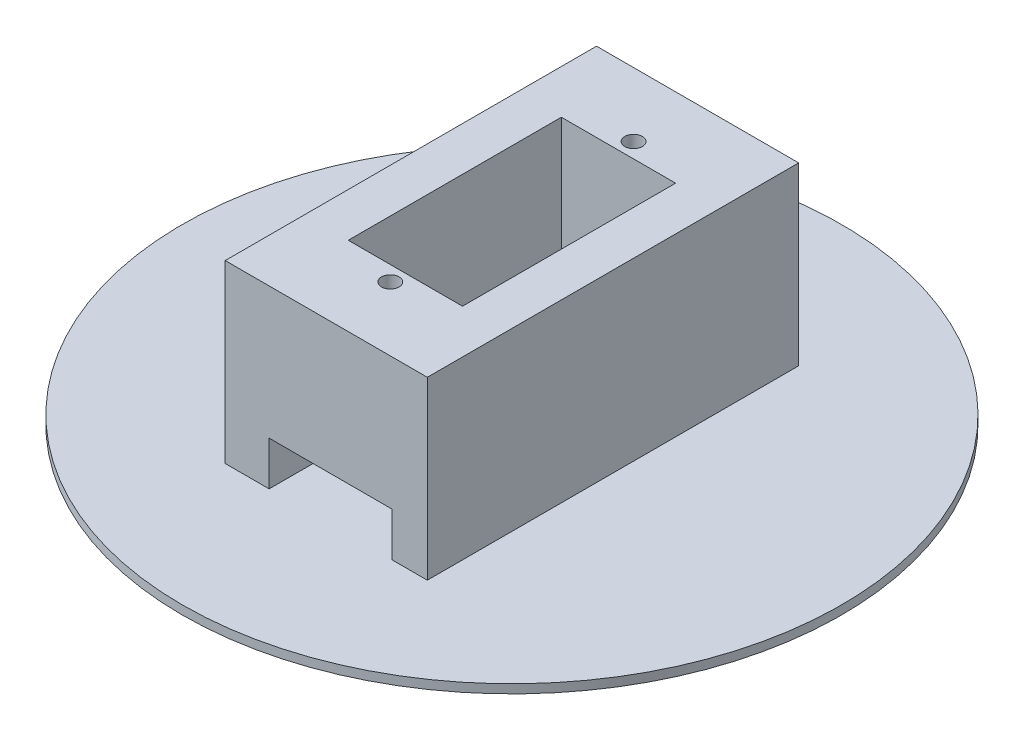
ISO-10303-21;
HEADER;
FILE_DESCRIPTION(('STEP AP214'),'2;1');
FILE_NAME('part.step','',(''),(''),'','','');
FILE_SCHEMA(('AUTOMOTIVE_DESIGN { 1 0 10303 214 1 1 1 1 }'));
ENDSEC;
DATA;
#1=APPLICATION_CONTEXT('core data for automotive mechanical design processes');
#2=APPLICATION_PROTOCOL_DEFINITION('international standard','automotive_design',2000,#1);
#3=PRODUCT_CONTEXT('',#1,'mechanical');
#4=PRODUCT('Part','Part','',(#3));
#5=PRODUCT_RELATED_PRODUCT_CATEGORY('part','',(#4));
#6=PRODUCT_DEFINITION_FORMATION('','',#4);
#7=PRODUCT_DEFINITION_CONTEXT('part definition',#1,'design');
#8=PRODUCT_DEFINITION('design','',#6,#7);
#9=PRODUCT_DEFINITION_SHAPE('','',#8);
#10=(LENGTH_UNIT() NAMED_UNIT(*) SI_UNIT(.MILLI.,.METRE.));
#11=(NAMED_UNIT(*) PLANE_ANGLE_UNIT() SI_UNIT($,.RADIAN.));
#12=(NAMED_UNIT(*) SI_UNIT($,.STERADIAN.) SOLID_ANGLE_UNIT());
#13=UNCERTAINTY_MEASURE_WITH_UNIT(LENGTH_MEASURE(1.E-05),#10,'distance_accuracy_value','');
#14=(GEOMETRIC_REPRESENTATION_CONTEXT(3) GLOBAL_UNCERTAINTY_ASSIGNED_CONTEXT((#13)) GLOBAL_UNIT_ASSIGNED_CONTEXT((#10,
#11,#12)) REPRESENTATION_CONTEXT('',''));
#15=CARTESIAN_POINT('',(0.,0.,0.));
#16=DIRECTION('',(0.,0.,1.));
#17=DIRECTION('',(1.,0.,0.));
#18=AXIS2_PLACEMENT_3D('',#15,#16,#17);
#19=CARTESIAN_POINT('',(-5.,20.,0.));
#20=DIRECTION('',(-1.,0.,0.));
#21=DIRECTION('',(0.,0.,1.));
#22=AXIS2_PLACEMENT_3D('',#19,#20,#21);
#23=PLANE('',#22);
#24=DIRECTION('',(0.,0.,-1.));
#25=VECTOR('',#24,1.);
#26=CARTESIAN_POINT('',(-5.,0.,0.));
#27=LINE('',#26,#25);
#28=CARTESIAN_POINT('',(-5.,0.,5.));
#29=VERTEX_POINT('',#28);
#30=CARTESIAN_POINT('',(-5.,0.,-37.25));
#31=VERTEX_POINT('',#30);
#32=EDGE_CURVE('E228',#29,#31,#27,.T.);
#33=ORIENTED_EDGE('',*,*,#32,.F.);
#34=DIRECTION('',(0.,-1.,0.));
#35=VECTOR('',#34,1.);
#36=CARTESIAN_POINT('',(-5.,20.,5.));
#37=LINE('',#36,#35);
#38=CARTESIAN_POINT('',(-5.,20.,5.));
#39=VERTEX_POINT('',#38);
#40=EDGE_CURVE('E12',#39,#29,#37,.T.);
#41=ORIENTED_EDGE('',*,*,#40,.F.);
#42=DIRECTION('',(0.,0.,-1.));
#43=VECTOR('',#42,1.);
#44=CARTESIAN_POINT('',(-5.,20.,0.));
#45=LINE('',#44,#43);
#46=CARTESIAN_POINT('',(-5.,20.,-37.25));
#47=VERTEX_POINT('',#46);
#48=EDGE_CURVE('E215',#39,#47,#45,.T.);
#49=ORIENTED_EDGE('',*,*,#48,.T.);
#50=DIRECTION('',(0.,-1.,0.));
#51=VECTOR('',#50,1.);
#52=CARTESIAN_POINT('',(-5.,20.,-37.25));
#53=LINE('',#52,#51);
#54=EDGE_CURVE('E239',#47,#31,#53,.T.);
#55=ORIENTED_EDGE('',*,*,#54,.T.);
#56=EDGE_LOOP('',(#33,#41,#49,#55));
#57=FACE_BOUND('',#56,.T.);
#58=ADVANCED_FACE('F51',(#57),#23,.T.);
#59=CARTESIAN_POINT('',(0.,20.,5.));
#60=DIRECTION('',(0.,0.,-1.));
#61=DIRECTION('',(-1.,0.,0.));
#62=AXIS2_PLACEMENT_3D('',#59,#60,#61);
#63=PLANE('',#62);
#64=DIRECTION('',(1.,0.,0.));
#65=VECTOR('',#64,1.);
#66=CARTESIAN_POINT('',(0.,0.,5.));
#67=LINE('',#66,#65);
#68=CARTESIAN_POINT('',(0.,0.,5.));
#69=VERTEX_POINT('',#68);
#70=EDGE_CURVE('E231',#29,#69,#67,.T.);
#71=ORIENTED_EDGE('',*,*,#70,.T.);
#72=DIRECTION('',(0.,1.,0.));
#73=VECTOR('',#72,1.);
#74=CARTESIAN_POINT('',(0.,20.,5.));
#75=LINE('',#74,#73);
#76=CARTESIAN_POINT('',(0.,5.,5.));
#77=VERTEX_POINT('',#76);
#78=EDGE_CURVE('E170',#69,#77,#75,.T.);
#79=ORIENTED_EDGE('',*,*,#78,.T.);
#80=DIRECTION('',(1.,0.,0.));
#81=VECTOR('',#80,1.);
#82=CARTESIAN_POINT('',(0.,5.,5.));
#83=LINE('',#82,#81);
#84=CARTESIAN_POINT('',(14.,5.,5.));
#85=VERTEX_POINT('',#84);
#86=EDGE_CURVE('E188',#77,#85,#83,.T.);
#87=ORIENTED_EDGE('',*,*,#86,.T.);
#88=DIRECTION('',(0.,-1.,0.));
#89=VECTOR('',#88,1.);
#90=CARTESIAN_POINT('',(14.,20.,5.));
#91=LINE('',#90,#89);
#92=CARTESIAN_POINT('',(14.,0.,5.));
#93=VERTEX_POINT('',#92);
#94=EDGE_CURVE('E174',#85,#93,#91,.T.);
#95=ORIENTED_EDGE('',*,*,#94,.T.);
#96=CARTESIAN_POINT('',(18.,0.,5.));
#97=VERTEX_POINT('',#96);
#98=EDGE_CURVE('E230',#93,#97,#67,.T.);
#99=ORIENTED_EDGE('',*,*,#98,.T.);
#100=DIRECTION('',(0.,-1.,0.));
#101=VECTOR('',#100,1.);
#102=CARTESIAN_POINT('',(18.,20.,5.));
#103=LINE('',#102,#101);
#104=CARTESIAN_POINT('',(18.,20.,5.));
#105=VERTEX_POINT('',#104);
#106=EDGE_CURVE('E60',#105,#97,#103,.T.);
#107=ORIENTED_EDGE('',*,*,#106,.F.);
#108=DIRECTION('',(1.,0.,0.));
#109=VECTOR('',#108,1.);
#110=CARTESIAN_POINT('',(0.,20.,5.));
#111=LINE('',#110,#109);
#112=EDGE_CURVE('E218',#39,#105,#111,.T.);
#113=ORIENTED_EDGE('',*,*,#112,.F.);
#114=ORIENTED_EDGE('',*,*,#40,.T.);
#115=EDGE_LOOP('',(#71,#79,#87,#95,#99,#107,#113,#114));
#116=FACE_BOUND('',#115,.T.);
#117=ADVANCED_FACE('F278',(#116),#63,.F.);
#118=CARTESIAN_POINT('',(18.,20.,0.));
#119=DIRECTION('',(-1.,0.,0.));
#120=DIRECTION('',(0.,0.,1.));
#121=AXIS2_PLACEMENT_3D('',#118,#119,#120);
#122=PLANE('',#121);
#123=DIRECTION('',(0.,0.,-1.));
#124=VECTOR('',#123,1.);
#125=CARTESIAN_POINT('',(18.,0.,0.));
#126=LINE('',#125,#124);
#127=CARTESIAN_POINT('',(18.,0.,-37.25));
#128=VERTEX_POINT('',#127);
#129=EDGE_CURVE('E234',#97,#128,#126,.T.);
#130=ORIENTED_EDGE('',*,*,#129,.T.);
#131=DIRECTION('',(0.,-1.,0.));
#132=VECTOR('',#131,1.);
#133=CARTESIAN_POINT('',(18.,20.,-37.25));
#134=LINE('',#133,#132);
#135=CARTESIAN_POINT('',(18.,20.,-37.25));
#136=VERTEX_POINT('',#135);
#137=EDGE_CURVE('E242',#136,#128,#134,.T.);
#138=ORIENTED_EDGE('',*,*,#137,.F.);
#139=DIRECTION('',(0.,0.,-1.));
#140=VECTOR('',#139,1.);
#141=CARTESIAN_POINT('',(18.,20.,0.));
#142=LINE('',#141,#140);
#143=EDGE_CURVE('E221',#105,#136,#142,.T.);
#144=ORIENTED_EDGE('',*,*,#143,.F.);
#145=ORIENTED_EDGE('',*,*,#106,.T.);
#146=EDGE_LOOP('',(#130,#138,#144,#145));
#147=FACE_BOUND('',#146,.T.);
#148=ADVANCED_FACE('F284',(#147),#122,.F.);
#149=CARTESIAN_POINT('',(0.,20.,-28.25));
#150=DIRECTION('',(0.,0.,1.));
#151=DIRECTION('',(1.,0.,0.));
#152=AXIS2_PLACEMENT_3D('',#149,#150,#151);
#153=PLANE('',#152);
#154=DIRECTION('',(-1.,0.,0.));
#155=VECTOR('',#154,1.);
#156=CARTESIAN_POINT('',(0.,5.,-28.25));
#157=LINE('',#156,#155);
#158=CARTESIAN_POINT('',(13.,5.,-28.25));
#159=VERTEX_POINT('',#158);
#160=CARTESIAN_POINT('',(0.,5.,-28.25));
#161=VERTEX_POINT('',#160);
#162=EDGE_CURVE('E146',#159,#161,#157,.T.);
#163=ORIENTED_EDGE('',*,*,#162,.F.);
#164=DIRECTION('',(0.,-1.,0.));
#165=VECTOR('',#164,1.);
#166=CARTESIAN_POINT('',(13.,20.,-28.25));
#167=LINE('',#166,#165);
#168=CARTESIAN_POINT('',(13.,20.,-28.25));
#169=VERTEX_POINT('',#168);
#170=EDGE_CURVE('E55',#169,#159,#167,.T.);
#171=ORIENTED_EDGE('',*,*,#170,.F.);
#172=DIRECTION('',(-1.,0.,0.));
#173=VECTOR('',#172,1.);
#174=CARTESIAN_POINT('',(0.,20.,-28.25));
#175=LINE('',#174,#173);
#176=CARTESIAN_POINT('',(0.,20.,-28.25));
#177=VERTEX_POINT('',#176);
#178=EDGE_CURVE('E200',#169,#177,#175,.T.);
#179=ORIENTED_EDGE('',*,*,#178,.T.);
#180=DIRECTION('',(0.,-1.,0.));
#181=VECTOR('',#180,1.);
#182=CARTESIAN_POINT('',(0.,20.,-28.25));
#183=LINE('',#182,#181);
#184=EDGE_CURVE('E226',#177,#161,#183,.T.);
#185=ORIENTED_EDGE('',*,*,#184,.T.);
#186=EDGE_LOOP('',(#163,#171,#179,#185));
#187=FACE_BOUND('',#186,.T.);
#188=ADVANCED_FACE('F260',(#187),#153,.T.);
#189=CARTESIAN_POINT('',(13.,20.,0.));
#190=DIRECTION('',(-1.,0.,0.));
#191=DIRECTION('',(0.,0.,1.));
#192=AXIS2_PLACEMENT_3D('',#189,#190,#191);
#193=PLANE('',#192);
#194=DIRECTION('',(0.,0.,-1.));
#195=VECTOR('',#194,1.);
#196=CARTESIAN_POINT('',(13.,5.,0.));
#197=LINE('',#196,#195);
#198=CARTESIAN_POINT('',(13.,5.,-4.));
#199=VERTEX_POINT('',#198);
#200=EDGE_CURVE('E185',#199,#159,#197,.T.);
#201=ORIENTED_EDGE('',*,*,#200,.F.);
#202=DIRECTION('',(0.,-1.,0.));
#203=VECTOR('',#202,1.);
#204=CARTESIAN_POINT('',(13.,20.,-4.));
#205=LINE('',#204,#203);
#206=CARTESIAN_POINT('',(13.,20.,-4.));
#207=VERTEX_POINT('',#206);
#208=EDGE_CURVE('E249',#207,#199,#205,.T.);
#209=ORIENTED_EDGE('',*,*,#208,.F.);
#210=DIRECTION('',(0.,0.,-1.));
#211=VECTOR('',#210,1.);
#212=CARTESIAN_POINT('',(13.,20.,0.));
#213=LINE('',#212,#211);
#214=EDGE_CURVE('E204',#207,#169,#213,.T.);
#215=ORIENTED_EDGE('',*,*,#214,.T.);
#216=ORIENTED_EDGE('',*,*,#170,.T.);
#217=EDGE_LOOP('',(#201,#209,#215,#216));
#218=FACE_BOUND('',#217,.T.);
#219=ADVANCED_FACE('F256',(#218),#193,.T.);
#220=CARTESIAN_POINT('',(0.,20.,-4.));
#221=DIRECTION('',(0.,0.,1.));
#222=DIRECTION('',(1.,0.,0.));
#223=AXIS2_PLACEMENT_3D('',#220,#221,#222);
#224=PLANE('',#223);
#225=ORIENTED_EDGE('',*,*,#208,.T.);
#226=DIRECTION('',(-1.,0.,0.));
#227=VECTOR('',#226,1.);
#228=CARTESIAN_POINT('',(0.,5.,-4.));
#229=LINE('',#228,#227);
#230=CARTESIAN_POINT('',(0.,5.,-4.));
#231=VERTEX_POINT('',#230);
#232=EDGE_CURVE('E183',#199,#231,#229,.T.);
#233=ORIENTED_EDGE('',*,*,#232,.T.);
#234=DIRECTION('',(0.,-1.,0.));
#235=VECTOR('',#234,1.);
#236=CARTESIAN_POINT('',(0.,20.,-4.));
#237=LINE('',#236,#235);
#238=CARTESIAN_POINT('',(0.,20.,-4.));
#239=VERTEX_POINT('',#238);
#240=EDGE_CURVE('E248',#239,#231,#237,.T.);
#241=ORIENTED_EDGE('',*,*,#240,.F.);
#242=DIRECTION('',(-1.,0.,0.));
#243=VECTOR('',#242,1.);
#244=CARTESIAN_POINT('',(0.,20.,-4.));
#245=LINE('',#244,#243);
#246=EDGE_CURVE('E207',#207,#239,#245,.T.);
#247=ORIENTED_EDGE('',*,*,#246,.F.);
#248=EDGE_LOOP('',(#225,#233,#241,#247));
#249=FACE_BOUND('',#248,.T.);
#250=ADVANCED_FACE('F265',(#249),#224,.F.);
#251=CARTESIAN_POINT('',(6.5,20.,-2.286));
#252=DIRECTION('',(0.,-1.,0.));
#253=DIRECTION('',(0.,0.,-1.));
#254=AXIS2_PLACEMENT_3D('',#251,#252,#253);
#255=CYLINDRICAL_SURFACE('',#254,1.);
#256=CARTESIAN_POINT('',(6.5,5.,-2.286));
#257=DIRECTION('',(0.,1.,0.));
#258=DIRECTION('',(-1.,0.,0.));
#259=AXIS2_PLACEMENT_3D('',#256,#257,#258);
#260=CIRCLE('',#259,1.);
#261=CARTESIAN_POINT('',(5.5,5.,-2.286));
#262=VERTEX_POINT('',#261);
#263=EDGE_CURVE('E180',#262,#262,#260,.T.);
#264=ORIENTED_EDGE('',*,*,#263,.F.);
#265=EDGE_LOOP('',(#264));
#266=FACE_BOUND('',#265,.T.);
#267=CARTESIAN_POINT('',(6.5,20.,-2.286));
#268=DIRECTION('',(0.,1.,0.));
#269=DIRECTION('',(0.,0.,1.));
#270=AXIS2_PLACEMENT_3D('',#267,#268,#269);
#271=CIRCLE('',#270,1.);
#272=CARTESIAN_POINT('',(6.5,20.,-1.286));
#273=VERTEX_POINT('',#272);
#274=EDGE_CURVE('E212',#273,#273,#271,.T.);
#275=ORIENTED_EDGE('',*,*,#274,.T.);
#276=EDGE_LOOP('',(#275));
#277=FACE_BOUND('',#276,.T.);
#278=ADVANCED_FACE('F267',(#266,#277),#255,.F.);
#279=CARTESIAN_POINT('',(0.,20.,0.));
#280=DIRECTION('',(-1.,0.,0.));
#281=DIRECTION('',(0.,0.,1.));
#282=AXIS2_PLACEMENT_3D('',#279,#280,#281);
#283=PLANE('',#282);
#284=ORIENTED_EDGE('',*,*,#240,.T.);
#285=DIRECTION('',(0.,0.,-1.));
#286=VECTOR('',#285,1.);
#287=CARTESIAN_POINT('',(0.,5.,130.75));
#288=LINE('',#287,#286);
#289=EDGE_CURVE('E74',#77,#231,#288,.T.);
#290=ORIENTED_EDGE('',*,*,#289,.F.);
#291=ORIENTED_EDGE('',*,*,#78,.F.);
#292=DIRECTION('',(0.,0.,-1.));
#293=VECTOR('',#292,1.);
#294=CARTESIAN_POINT('',(0.,0.,0.));
#295=LINE('',#294,#293);
#296=CARTESIAN_POINT('',(0.,0.,-37.25));
#297=VERTEX_POINT('',#296);
#298=EDGE_CURVE('E157',#69,#297,#295,.T.);
#299=ORIENTED_EDGE('',*,*,#298,.T.);
#300=DIRECTION('',(0.,1.,0.));
#301=VECTOR('',#300,1.);
#302=CARTESIAN_POINT('',(0.,0.,-37.25));
#303=LINE('',#302,#301);
#304=CARTESIAN_POINT('',(0.,5.,-37.25));
#305=VERTEX_POINT('',#304);
#306=EDGE_CURVE('E153',#297,#305,#303,.T.);
#307=ORIENTED_EDGE('',*,*,#306,.T.);
#308=EDGE_CURVE('E139',#161,#305,#288,.T.);
#309=ORIENTED_EDGE('',*,*,#308,.F.);
#310=ORIENTED_EDGE('',*,*,#184,.F.);
#311=DIRECTION('',(0.,0.,-1.));
#312=VECTOR('',#311,1.);
#313=CARTESIAN_POINT('',(0.,20.,0.));
#314=LINE('',#313,#312);
#315=EDGE_CURVE('E210',#239,#177,#314,.T.);
#316=ORIENTED_EDGE('',*,*,#315,.F.);
#317=EDGE_LOOP('',(#284,#290,#291,#299,#307,#309,#310,#316));
#318=FACE_BOUND('',#317,.T.);
#319=ADVANCED_FACE('F155',(#318),#283,.F.);
#320=CARTESIAN_POINT('',(6.5,20.,-29.964));
#321=DIRECTION('',(0.,-1.,0.));
#322=DIRECTION('',(0.,0.,-1.));
#323=AXIS2_PLACEMENT_3D('',#320,#321,#322);
#324=CYLINDRICAL_SURFACE('',#323,1.);
#325=CARTESIAN_POINT('',(6.5,5.,-29.964));
#326=DIRECTION('',(0.,1.,0.));
#327=DIRECTION('',(-1.,0.,0.));
#328=AXIS2_PLACEMENT_3D('',#325,#326,#327);
#329=CIRCLE('',#328,1.);
#330=CARTESIAN_POINT('',(5.5,5.,-29.964));
#331=VERTEX_POINT('',#330);
#332=EDGE_CURVE('E177',#331,#331,#329,.T.);
#333=ORIENTED_EDGE('',*,*,#332,.F.);
#334=EDGE_LOOP('',(#333));
#335=FACE_BOUND('',#334,.T.);
#336=CARTESIAN_POINT('',(6.5,20.,-29.964));
#337=DIRECTION('',(0.,1.,0.));
#338=DIRECTION('',(0.,0.,1.));
#339=AXIS2_PLACEMENT_3D('',#336,#337,#338);
#340=CIRCLE('',#339,1.);
#341=CARTESIAN_POINT('',(6.5,20.,-28.964));
#342=VERTEX_POINT('',#341);
#343=EDGE_CURVE('E197',#342,#342,#340,.T.);
#344=ORIENTED_EDGE('',*,*,#343,.T.);
#345=EDGE_LOOP('',(#344));
#346=FACE_BOUND('',#345,.T.);
#347=ADVANCED_FACE('F53',(#335,#346),#324,.F.);
#348=CARTESIAN_POINT('',(0.,20.,-37.25));
#349=DIRECTION('',(0.,0.,-1.));
#350=DIRECTION('',(-1.,0.,0.));
#351=AXIS2_PLACEMENT_3D('',#348,#349,#350);
#352=PLANE('',#351);
#353=ORIENTED_EDGE('',*,*,#306,.F.);
#354=DIRECTION('',(1.,0.,0.));
#355=VECTOR('',#354,1.);
#356=CARTESIAN_POINT('',(0.,0.,-37.25));
#357=LINE('',#356,#355);
#358=EDGE_CURVE('E201',#31,#297,#357,.T.);
#359=ORIENTED_EDGE('',*,*,#358,.F.);
#360=ORIENTED_EDGE('',*,*,#54,.F.);
#361=DIRECTION('',(1.,0.,0.));
#362=VECTOR('',#361,1.);
#363=CARTESIAN_POINT('',(0.,20.,-37.25));
#364=LINE('',#363,#362);
#365=EDGE_CURVE('E223',#47,#136,#364,.T.);
#366=ORIENTED_EDGE('',*,*,#365,.T.);
#367=ORIENTED_EDGE('',*,*,#137,.T.);
#368=CARTESIAN_POINT('',(14.,0.,-37.25));
#369=VERTEX_POINT('',#368);
#370=EDGE_CURVE('E237',#369,#128,#357,.T.);
#371=ORIENTED_EDGE('',*,*,#370,.F.);
#372=DIRECTION('',(0.,-1.,0.));
#373=VECTOR('',#372,1.);
#374=CARTESIAN_POINT('',(14.,0.,-37.25));
#375=LINE('',#374,#373);
#376=CARTESIAN_POINT('',(14.,5.,-37.25));
#377=VERTEX_POINT('',#376);
#378=EDGE_CURVE('E150',#377,#369,#375,.T.);
#379=ORIENTED_EDGE('',*,*,#378,.F.);
#380=DIRECTION('',(1.,0.,0.));
#381=VECTOR('',#380,1.);
#382=CARTESIAN_POINT('',(0.,5.,-37.25));
#383=LINE('',#382,#381);
#384=EDGE_CURVE('E143',#305,#377,#383,.T.);
#385=ORIENTED_EDGE('',*,*,#384,.F.);
#386=EDGE_LOOP('',(#353,#359,#360,#366,#367,#371,#379,#385));
#387=FACE_BOUND('',#386,.T.);
#388=ADVANCED_FACE('F162',(#387),#352,.T.);
#389=CARTESIAN_POINT('',(0.,20.,0.));
#390=DIRECTION('',(0.,1.,0.));
#391=DIRECTION('',(0.,0.,1.));
#392=AXIS2_PLACEMENT_3D('',#389,#390,#391);
#393=PLANE('',#392);
#394=ORIENTED_EDGE('',*,*,#343,.F.);
#395=EDGE_LOOP('',(#394));
#396=FACE_BOUND('',#395,.T.);
#397=ORIENTED_EDGE('',*,*,#178,.F.);
#398=ORIENTED_EDGE('',*,*,#214,.F.);
#399=ORIENTED_EDGE('',*,*,#246,.T.);
#400=ORIENTED_EDGE('',*,*,#315,.T.);
#401=EDGE_LOOP('',(#397,#398,#399,#400));
#402=FACE_BOUND('',#401,.T.);
#403=ORIENTED_EDGE('',*,*,#274,.F.);
#404=EDGE_LOOP('',(#403));
#405=FACE_BOUND('',#404,.T.);
#406=ORIENTED_EDGE('',*,*,#48,.F.);
#407=ORIENTED_EDGE('',*,*,#112,.T.);
#408=ORIENTED_EDGE('',*,*,#143,.T.);
#409=ORIENTED_EDGE('',*,*,#365,.F.);
#410=EDGE_LOOP('',(#406,#407,#408,#409));
#411=FACE_BOUND('',#410,.T.);
#412=ADVANCED_FACE('F262',(#396,#402,#405,#411),#393,.T.);
#413=CARTESIAN_POINT('',(0.,-1.,0.));
#414=DIRECTION('',(0.,1.,0.));
#415=DIRECTION('',(0.,0.,1.));
#416=AXIS2_PLACEMENT_3D('',#413,#414,#415);
#417=PLANE('',#416);
#418=CARTESIAN_POINT('',(6.5,-1.,-16.125));
#419=DIRECTION('',(0.,1.,0.));
#420=DIRECTION('',(0.,0.,1.));
#421=AXIS2_PLACEMENT_3D('',#418,#419,#420);
#422=CIRCLE('',#421,37.5);
#423=CARTESIAN_POINT('',(6.5,-1.,21.375));
#424=VERTEX_POINT('',#423);
#425=EDGE_CURVE('E192',#424,#424,#422,.T.);
#426=ORIENTED_EDGE('',*,*,#425,.F.);
#427=EDGE_LOOP('',(#426));
#428=FACE_BOUND('',#427,.T.);
#429=ADVANCED_FACE('F303',(#428),#417,.F.);
#430=CARTESIAN_POINT('',(6.5,-1.,-16.125));
#431=DIRECTION('',(0.,1.,0.));
#432=DIRECTION('',(0.,0.,1.));
#433=AXIS2_PLACEMENT_3D('',#430,#431,#432);
#434=CYLINDRICAL_SURFACE('',#433,37.5);
#435=ORIENTED_EDGE('',*,*,#425,.T.);
#436=EDGE_LOOP('',(#435));
#437=FACE_BOUND('',#436,.T.);
#438=CARTESIAN_POINT('',(6.5,0.,-16.125));
#439=DIRECTION('',(0.,1.,0.));
#440=DIRECTION('',(0.,0.,1.));
#441=AXIS2_PLACEMENT_3D('',#438,#439,#440);
#442=CIRCLE('',#441,37.5);
#443=CARTESIAN_POINT('',(6.5,0.,21.375));
#444=VERTEX_POINT('',#443);
#445=EDGE_CURVE('E191',#444,#444,#442,.T.);
#446=ORIENTED_EDGE('',*,*,#445,.F.);
#447=EDGE_LOOP('',(#446));
#448=FACE_BOUND('',#447,.T.);
#449=ADVANCED_FACE('F308',(#437,#448),#434,.T.);
#450=CARTESIAN_POINT('',(0.,5.,130.75));
#451=DIRECTION('',(0.,1.,0.));
#452=DIRECTION('',(-1.,0.,0.));
#453=AXIS2_PLACEMENT_3D('',#450,#451,#452);
#454=PLANE('',#453);
#455=ORIENTED_EDGE('',*,*,#263,.T.);
#456=EDGE_LOOP('',(#455));
#457=FACE_BOUND('',#456,.T.);
#458=ORIENTED_EDGE('',*,*,#332,.T.);
#459=EDGE_LOOP('',(#458));
#460=FACE_BOUND('',#459,.T.);
#461=ORIENTED_EDGE('',*,*,#289,.T.);
#462=ORIENTED_EDGE('',*,*,#232,.F.);
#463=ORIENTED_EDGE('',*,*,#200,.T.);
#464=ORIENTED_EDGE('',*,*,#162,.T.);
#465=ORIENTED_EDGE('',*,*,#308,.T.);
#466=ORIENTED_EDGE('',*,*,#384,.T.);
#467=DIRECTION('',(0.,0.,-1.));
#468=VECTOR('',#467,1.);
#469=CARTESIAN_POINT('',(14.,5.,130.75));
#470=LINE('',#469,#468);
#471=EDGE_CURVE('E68',#85,#377,#470,.T.);
#472=ORIENTED_EDGE('',*,*,#471,.F.);
#473=ORIENTED_EDGE('',*,*,#86,.F.);
#474=EDGE_LOOP('',(#461,#462,#463,#464,#465,#466,#472,#473));
#475=FACE_BOUND('',#474,.T.);
#476=ADVANCED_FACE('F141',(#457,#460,#475),#454,.F.);
#477=CARTESIAN_POINT('',(14.,0.,130.75));
#478=DIRECTION('',(1.,0.,0.));
#479=DIRECTION('',(0.,0.,-1.));
#480=AXIS2_PLACEMENT_3D('',#477,#478,#479);
#481=PLANE('',#480);
#482=ORIENTED_EDGE('',*,*,#471,.T.);
#483=ORIENTED_EDGE('',*,*,#378,.T.);
#484=DIRECTION('',(0.,0.,-1.));
#485=VECTOR('',#484,1.);
#486=CARTESIAN_POINT('',(14.,0.,130.75));
#487=LINE('',#486,#485);
#488=EDGE_CURVE('E167',#93,#369,#487,.T.);
#489=ORIENTED_EDGE('',*,*,#488,.F.);
#490=ORIENTED_EDGE('',*,*,#94,.F.);
#491=EDGE_LOOP('',(#482,#483,#489,#490));
#492=FACE_BOUND('',#491,.T.);
#493=ADVANCED_FACE('F330',(#492),#481,.F.);
#494=CARTESIAN_POINT('',(0.,0.,0.));
#495=DIRECTION('',(0.,1.,0.));
#496=DIRECTION('',(0.,0.,1.));
#497=AXIS2_PLACEMENT_3D('',#494,#495,#496);
#498=PLANE('',#497);
#499=ORIENTED_EDGE('',*,*,#298,.F.);
#500=ORIENTED_EDGE('',*,*,#70,.F.);
#501=ORIENTED_EDGE('',*,*,#32,.T.);
#502=ORIENTED_EDGE('',*,*,#358,.T.);
#503=EDGE_LOOP('',(#499,#500,#501,#502));
#504=FACE_BOUND('',#503,.T.);
#505=ORIENTED_EDGE('',*,*,#98,.F.);
#506=ORIENTED_EDGE('',*,*,#488,.T.);
#507=ORIENTED_EDGE('',*,*,#370,.T.);
#508=ORIENTED_EDGE('',*,*,#129,.F.);
#509=EDGE_LOOP('',(#505,#506,#507,#508));
#510=FACE_BOUND('',#509,.T.);
#511=ORIENTED_EDGE('',*,*,#445,.T.);
#512=EDGE_LOOP('',(#511));
#513=FACE_BOUND('',#512,.T.);
#514=ADVANCED_FACE('F323',(#504,#510,#513),#498,.T.);
#515=CLOSED_SHELL('',(#58,#117,#148,#188,#219,#250,#278,#319,#347,#388,#412,#429,#449,#476,#493,#514));
#516=MANIFOLD_SOLID_BREP('B2',#515);
#517=ADVANCED_BREP_SHAPE_REPRESENTATION('',(#18,#516),#14);
#518=SHAPE_DEFINITION_REPRESENTATION(#9,#517);
ENDSEC;
END-ISO-10303-21;
